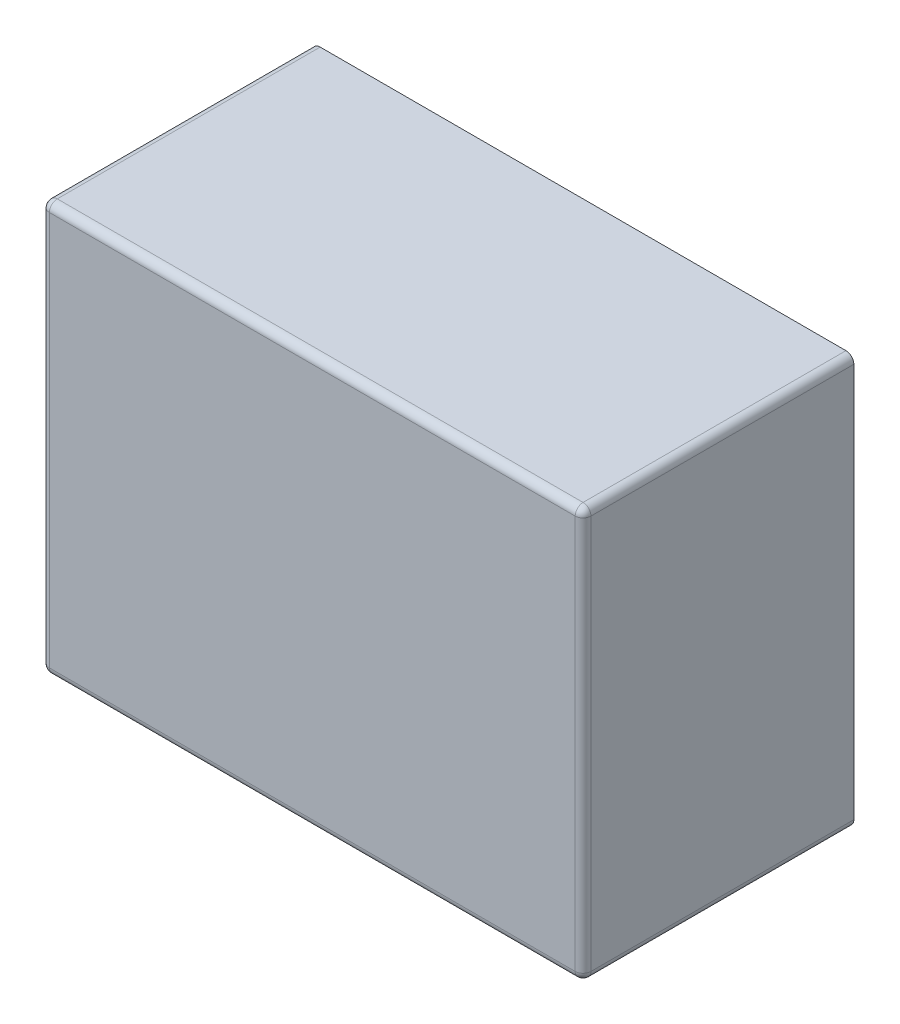
ISO-10303-21;
HEADER;
FILE_DESCRIPTION(('STEP AP214'),'2;1');
FILE_NAME('part.step','',(''),(''),'','','');
FILE_SCHEMA(('AUTOMOTIVE_DESIGN { 1 0 10303 214 1 1 1 1 }'));
ENDSEC;
DATA;
#1=APPLICATION_CONTEXT('core data for automotive mechanical design processes');
#2=APPLICATION_PROTOCOL_DEFINITION('international standard','automotive_design',2000,#1);
#3=PRODUCT_CONTEXT('',#1,'mechanical');
#4=PRODUCT('Part','Part','',(#3));
#5=PRODUCT_RELATED_PRODUCT_CATEGORY('part','',(#4));
#6=PRODUCT_DEFINITION_FORMATION('','',#4);
#7=PRODUCT_DEFINITION_CONTEXT('part definition',#1,'design');
#8=PRODUCT_DEFINITION('design','',#6,#7);
#9=PRODUCT_DEFINITION_SHAPE('','',#8);
#10=(LENGTH_UNIT() NAMED_UNIT(*) SI_UNIT(.MILLI.,.METRE.));
#11=(NAMED_UNIT(*) PLANE_ANGLE_UNIT() SI_UNIT($,.RADIAN.));
#12=(NAMED_UNIT(*) SI_UNIT($,.STERADIAN.) SOLID_ANGLE_UNIT());
#13=UNCERTAINTY_MEASURE_WITH_UNIT(LENGTH_MEASURE(1.E-05),#10,'distance_accuracy_value','');
#14=(GEOMETRIC_REPRESENTATION_CONTEXT(3) GLOBAL_UNCERTAINTY_ASSIGNED_CONTEXT((#13)) GLOBAL_UNIT_ASSIGNED_CONTEXT((#10,
#11,#12)) REPRESENTATION_CONTEXT('',''));
#15=CARTESIAN_POINT('',(0.,0.,0.));
#16=DIRECTION('',(0.,0.,1.));
#17=DIRECTION('',(1.,0.,0.));
#18=AXIS2_PLACEMENT_3D('',#15,#16,#17);
#19=CARTESIAN_POINT('',(0.,0.,103.));
#20=DIRECTION('',(0.,0.,1.));
#21=DIRECTION('',(1.,0.,0.));
#22=AXIS2_PLACEMENT_3D('',#19,#20,#21);
#23=PLANE('',#22);
#24=DIRECTION('',(1.,0.,0.));
#25=VECTOR('',#24,1.);
#26=CARTESIAN_POINT('',(-100.,-75.,103.));
#27=LINE('',#26,#25);
#28=CARTESIAN_POINT('',(-100.,-75.,103.));
#29=VERTEX_POINT('',#28);
#30=CARTESIAN_POINT('',(100.,-75.,103.));
#31=VERTEX_POINT('',#30);
#32=EDGE_CURVE('E245',#29,#31,#27,.T.);
#33=ORIENTED_EDGE('',*,*,#32,.T.);
#34=DIRECTION('',(0.,1.,0.));
#35=VECTOR('',#34,1.);
#36=CARTESIAN_POINT('',(100.,-75.,103.));
#37=LINE('',#36,#35);
#38=CARTESIAN_POINT('',(100.,75.,103.));
#39=VERTEX_POINT('',#38);
#40=EDGE_CURVE('E46',#31,#39,#37,.T.);
#41=ORIENTED_EDGE('',*,*,#40,.T.);
#42=DIRECTION('',(-1.,0.,0.));
#43=VECTOR('',#42,1.);
#44=CARTESIAN_POINT('',(100.,75.,103.));
#45=LINE('',#44,#43);
#46=CARTESIAN_POINT('',(-100.,75.,103.));
#47=VERTEX_POINT('',#46);
#48=EDGE_CURVE('E10',#39,#47,#45,.T.);
#49=ORIENTED_EDGE('',*,*,#48,.T.);
#50=DIRECTION('',(0.,-1.,0.));
#51=VECTOR('',#50,1.);
#52=CARTESIAN_POINT('',(-100.,75.,103.));
#53=LINE('',#52,#51);
#54=EDGE_CURVE('E297',#47,#29,#53,.T.);
#55=ORIENTED_EDGE('',*,*,#54,.T.);
#56=EDGE_LOOP('',(#33,#41,#49,#55));
#57=FACE_BOUND('',#56,.T.);
#58=ADVANCED_FACE('F16',(#57),#23,.T.);
#59=CARTESIAN_POINT('',(100.,75.,100.));
#60=DIRECTION('',(-1.,0.,0.));
#61=DIRECTION('',(0.,0.,-1.));
#62=AXIS2_PLACEMENT_3D('',#59,#60,#61);
#63=CYLINDRICAL_SURFACE('',#62,3.);
#64=CARTESIAN_POINT('',(-100.,75.,100.));
#65=DIRECTION('',(1.,0.,0.));
#66=DIRECTION('',(0.,0.,-1.));
#67=AXIS2_PLACEMENT_3D('',#64,#65,#66);
#68=CIRCLE('',#67,3.);
#69=CARTESIAN_POINT('',(-100.,78.,100.));
#70=VERTEX_POINT('',#69);
#71=EDGE_CURVE('E294',#70,#47,#68,.T.);
#72=ORIENTED_EDGE('',*,*,#71,.T.);
#73=ORIENTED_EDGE('',*,*,#48,.F.);
#74=CARTESIAN_POINT('',(100.,75.,100.));
#75=DIRECTION('',(1.,0.,0.));
#76=DIRECTION('',(0.,0.,-1.));
#77=AXIS2_PLACEMENT_3D('',#74,#75,#76);
#78=CIRCLE('',#77,3.);
#79=CARTESIAN_POINT('',(100.,78.,100.));
#80=VERTEX_POINT('',#79);
#81=EDGE_CURVE('E25',#80,#39,#78,.T.);
#82=ORIENTED_EDGE('',*,*,#81,.F.);
#83=DIRECTION('',(-1.,0.,0.));
#84=VECTOR('',#83,1.);
#85=CARTESIAN_POINT('',(100.,78.,100.));
#86=LINE('',#85,#84);
#87=EDGE_CURVE('E286',#80,#70,#86,.T.);
#88=ORIENTED_EDGE('',*,*,#87,.T.);
#89=EDGE_LOOP('',(#72,#73,#82,#88));
#90=FACE_BOUND('',#89,.T.);
#91=ADVANCED_FACE('F377',(#90),#63,.T.);
#92=CARTESIAN_POINT('',(100.,75.,100.));
#93=DIRECTION('',(0.,0.707106781186548,-0.707106781186548));
#94=DIRECTION('',(-0.577350269189626,-0.577350269189626,-0.577350269189626));
#95=AXIS2_PLACEMENT_3D('',#92,#93,#94);
#96=SPHERICAL_SURFACE('',#95,3.);
#97=CARTESIAN_POINT('',(100.,75.,100.));
#98=DIRECTION('',(0.,0.,1.));
#99=DIRECTION('',(0.,-1.,0.));
#100=AXIS2_PLACEMENT_3D('',#97,#98,#99);
#101=CIRCLE('',#100,3.);
#102=CARTESIAN_POINT('',(103.,75.,100.));
#103=VERTEX_POINT('',#102);
#104=EDGE_CURVE('E282',#103,#80,#101,.T.);
#105=ORIENTED_EDGE('',*,*,#104,.T.);
#106=ORIENTED_EDGE('',*,*,#81,.T.);
#107=CARTESIAN_POINT('',(100.,75.,100.));
#108=DIRECTION('',(0.,-1.,0.));
#109=DIRECTION('',(0.,0.,-1.));
#110=AXIS2_PLACEMENT_3D('',#107,#108,#109);
#111=CIRCLE('',#110,3.);
#112=EDGE_CURVE('E19',#103,#39,#111,.T.);
#113=ORIENTED_EDGE('',*,*,#112,.F.);
#114=EDGE_LOOP('',(#105,#106,#113));
#115=FACE_BOUND('',#114,.T.);
#116=ADVANCED_FACE('F376',(#115),#96,.T.);
#117=CARTESIAN_POINT('',(100.,-75.,100.));
#118=DIRECTION('',(0.,1.,0.));
#119=DIRECTION('',(0.,0.,-1.));
#120=AXIS2_PLACEMENT_3D('',#117,#118,#119);
#121=CYLINDRICAL_SURFACE('',#120,3.);
#122=ORIENTED_EDGE('',*,*,#112,.T.);
#123=ORIENTED_EDGE('',*,*,#40,.F.);
#124=CARTESIAN_POINT('',(100.,-75.,100.));
#125=DIRECTION('',(0.,-1.,0.));
#126=DIRECTION('',(0.,0.,-1.));
#127=AXIS2_PLACEMENT_3D('',#124,#125,#126);
#128=CIRCLE('',#127,3.);
#129=CARTESIAN_POINT('',(103.,-75.,100.));
#130=VERTEX_POINT('',#129);
#131=EDGE_CURVE('E249',#130,#31,#128,.T.);
#132=ORIENTED_EDGE('',*,*,#131,.F.);
#133=DIRECTION('',(0.,1.,0.));
#134=VECTOR('',#133,1.);
#135=CARTESIAN_POINT('',(103.,-75.,100.));
#136=LINE('',#135,#134);
#137=EDGE_CURVE('E259',#130,#103,#136,.T.);
#138=ORIENTED_EDGE('',*,*,#137,.T.);
#139=EDGE_LOOP('',(#122,#123,#132,#138));
#140=FACE_BOUND('',#139,.T.);
#141=ADVANCED_FACE('F409',(#140),#121,.T.);
#142=CARTESIAN_POINT('',(100.,-75.,100.));
#143=DIRECTION('',(0.707106781186548,0.,-0.707106781186548));
#144=DIRECTION('',(-0.577350269189626,0.577350269189626,-0.577350269189626));
#145=AXIS2_PLACEMENT_3D('',#142,#143,#144);
#146=SPHERICAL_SURFACE('',#145,3.);
#147=CARTESIAN_POINT('',(100.,-75.,100.));
#148=DIRECTION('',(0.,0.,1.));
#149=DIRECTION('',(-1.,0.,0.));
#150=AXIS2_PLACEMENT_3D('',#147,#148,#149);
#151=CIRCLE('',#150,3.);
#152=CARTESIAN_POINT('',(100.,-78.,100.));
#153=VERTEX_POINT('',#152);
#154=EDGE_CURVE('E264',#153,#130,#151,.T.);
#155=ORIENTED_EDGE('',*,*,#154,.T.);
#156=ORIENTED_EDGE('',*,*,#131,.T.);
#157=CARTESIAN_POINT('',(100.,-75.,100.));
#158=DIRECTION('',(-1.,0.,0.));
#159=DIRECTION('',(0.,0.,-1.));
#160=AXIS2_PLACEMENT_3D('',#157,#158,#159);
#161=CIRCLE('',#160,3.);
#162=EDGE_CURVE('E250',#153,#31,#161,.T.);
#163=ORIENTED_EDGE('',*,*,#162,.F.);
#164=EDGE_LOOP('',(#155,#156,#163));
#165=FACE_BOUND('',#164,.T.);
#166=ADVANCED_FACE('F351',(#165),#146,.T.);
#167=CARTESIAN_POINT('',(-100.,-75.,100.));
#168=DIRECTION('',(1.,0.,0.));
#169=DIRECTION('',(0.,0.,-1.));
#170=AXIS2_PLACEMENT_3D('',#167,#168,#169);
#171=CYLINDRICAL_SURFACE('',#170,3.);
#172=ORIENTED_EDGE('',*,*,#162,.T.);
#173=ORIENTED_EDGE('',*,*,#32,.F.);
#174=CARTESIAN_POINT('',(-100.,-75.,100.));
#175=DIRECTION('',(-1.,0.,0.));
#176=DIRECTION('',(0.,0.,-1.));
#177=AXIS2_PLACEMENT_3D('',#174,#175,#176);
#178=CIRCLE('',#177,3.);
#179=CARTESIAN_POINT('',(-100.,-78.,100.));
#180=VERTEX_POINT('',#179);
#181=EDGE_CURVE('E301',#180,#29,#178,.T.);
#182=ORIENTED_EDGE('',*,*,#181,.F.);
#183=DIRECTION('',(1.,0.,0.));
#184=VECTOR('',#183,1.);
#185=CARTESIAN_POINT('',(-100.,-78.,100.));
#186=LINE('',#185,#184);
#187=EDGE_CURVE('E258',#180,#153,#186,.T.);
#188=ORIENTED_EDGE('',*,*,#187,.T.);
#189=EDGE_LOOP('',(#172,#173,#182,#188));
#190=FACE_BOUND('',#189,.T.);
#191=ADVANCED_FACE('F354',(#190),#171,.T.);
#192=CARTESIAN_POINT('',(-100.,-75.,100.));
#193=DIRECTION('',(0.707106781186548,0.,0.707106781186548));
#194=DIRECTION('',(0.577350269189626,0.577350269189626,-0.577350269189626));
#195=AXIS2_PLACEMENT_3D('',#192,#193,#194);
#196=SPHERICAL_SURFACE('',#195,3.);
#197=CARTESIAN_POINT('',(-100.,-75.,100.));
#198=DIRECTION('',(0.,0.,-1.));
#199=DIRECTION('',(1.,0.,0.));
#200=AXIS2_PLACEMENT_3D('',#197,#198,#199);
#201=CIRCLE('',#200,3.);
#202=CARTESIAN_POINT('',(-103.,-75.,100.));
#203=VERTEX_POINT('',#202);
#204=EDGE_CURVE('E244',#180,#203,#201,.T.);
#205=ORIENTED_EDGE('',*,*,#204,.F.);
#206=ORIENTED_EDGE('',*,*,#181,.T.);
#207=CARTESIAN_POINT('',(-100.,-75.,100.));
#208=DIRECTION('',(0.,1.,0.));
#209=DIRECTION('',(0.,0.,-1.));
#210=AXIS2_PLACEMENT_3D('',#207,#208,#209);
#211=CIRCLE('',#210,3.);
#212=EDGE_CURVE('E187',#203,#29,#211,.T.);
#213=ORIENTED_EDGE('',*,*,#212,.F.);
#214=EDGE_LOOP('',(#205,#206,#213));
#215=FACE_BOUND('',#214,.T.);
#216=ADVANCED_FACE('F385',(#215),#196,.T.);
#217=CARTESIAN_POINT('',(-100.,75.,100.));
#218=DIRECTION('',(0.,-1.,0.));
#219=DIRECTION('',(0.,0.,-1.));
#220=AXIS2_PLACEMENT_3D('',#217,#218,#219);
#221=CYLINDRICAL_SURFACE('',#220,3.);
#222=ORIENTED_EDGE('',*,*,#212,.T.);
#223=ORIENTED_EDGE('',*,*,#54,.F.);
#224=CARTESIAN_POINT('',(-100.,75.,100.));
#225=DIRECTION('',(0.,1.,0.));
#226=DIRECTION('',(0.,0.,-1.));
#227=AXIS2_PLACEMENT_3D('',#224,#225,#226);
#228=CIRCLE('',#227,3.);
#229=CARTESIAN_POINT('',(-103.,75.,100.));
#230=VERTEX_POINT('',#229);
#231=EDGE_CURVE('E290',#230,#47,#228,.T.);
#232=ORIENTED_EDGE('',*,*,#231,.F.);
#233=DIRECTION('',(0.,-1.,0.));
#234=VECTOR('',#233,1.);
#235=CARTESIAN_POINT('',(-103.,75.,100.));
#236=LINE('',#235,#234);
#237=EDGE_CURVE('E195',#230,#203,#236,.T.);
#238=ORIENTED_EDGE('',*,*,#237,.T.);
#239=EDGE_LOOP('',(#222,#223,#232,#238));
#240=FACE_BOUND('',#239,.T.);
#241=ADVANCED_FACE('F383',(#240),#221,.T.);
#242=CARTESIAN_POINT('',(-100.,75.,100.));
#243=DIRECTION('',(-0.707106781186548,0.,-0.707106781186548));
#244=DIRECTION('',(0.577350269189626,-0.577350269189626,-0.577350269189626));
#245=AXIS2_PLACEMENT_3D('',#242,#243,#244);
#246=SPHERICAL_SURFACE('',#245,3.);
#247=CARTESIAN_POINT('',(-100.,75.,100.));
#248=DIRECTION('',(0.,0.,1.));
#249=DIRECTION('',(1.,0.,0.));
#250=AXIS2_PLACEMENT_3D('',#247,#248,#249);
#251=CIRCLE('',#250,3.);
#252=EDGE_CURVE('E228',#70,#230,#251,.T.);
#253=ORIENTED_EDGE('',*,*,#252,.T.);
#254=ORIENTED_EDGE('',*,*,#231,.T.);
#255=ORIENTED_EDGE('',*,*,#71,.F.);
#256=EDGE_LOOP('',(#253,#254,#255));
#257=FACE_BOUND('',#256,.T.);
#258=ADVANCED_FACE('F379',(#257),#246,.T.);
#259=CARTESIAN_POINT('',(100.,78.,0.));
#260=DIRECTION('',(0.,-1.,0.));
#261=DIRECTION('',(0.,0.,-1.));
#262=AXIS2_PLACEMENT_3D('',#259,#260,#261);
#263=PLANE('',#262);
#264=ORIENTED_EDGE('',*,*,#87,.F.);
#265=DIRECTION('',(0.,0.,1.));
#266=VECTOR('',#265,1.);
#267=CARTESIAN_POINT('',(100.,78.,0.));
#268=LINE('',#267,#266);
#269=CARTESIAN_POINT('',(100.,78.,0.));
#270=VERTEX_POINT('',#269);
#271=EDGE_CURVE('E278',#270,#80,#268,.T.);
#272=ORIENTED_EDGE('',*,*,#271,.F.);
#273=DIRECTION('',(-1.,0.,0.));
#274=VECTOR('',#273,1.);
#275=CARTESIAN_POINT('',(100.,78.,0.));
#276=LINE('',#275,#274);
#277=CARTESIAN_POINT('',(-100.,78.,0.));
#278=VERTEX_POINT('',#277);
#279=EDGE_CURVE('E163',#270,#278,#276,.T.);
#280=ORIENTED_EDGE('',*,*,#279,.T.);
#281=DIRECTION('',(0.,0.,1.));
#282=VECTOR('',#281,1.);
#283=CARTESIAN_POINT('',(-100.,78.,0.));
#284=LINE('',#283,#282);
#285=EDGE_CURVE('E232',#278,#70,#284,.T.);
#286=ORIENTED_EDGE('',*,*,#285,.T.);
#287=EDGE_LOOP('',(#264,#272,#280,#286));
#288=FACE_BOUND('',#287,.T.);
#289=ADVANCED_FACE('F371',(#288),#263,.F.);
#290=CARTESIAN_POINT('',(100.,75.,0.));
#291=DIRECTION('',(0.,0.,1.));
#292=DIRECTION('',(0.,-1.,0.));
#293=AXIS2_PLACEMENT_3D('',#290,#291,#292);
#294=CYLINDRICAL_SURFACE('',#293,3.);
#295=ORIENTED_EDGE('',*,*,#271,.T.);
#296=ORIENTED_EDGE('',*,*,#104,.F.);
#297=DIRECTION('',(0.,0.,1.));
#298=VECTOR('',#297,1.);
#299=CARTESIAN_POINT('',(103.,75.,0.));
#300=LINE('',#299,#298);
#301=CARTESIAN_POINT('',(103.,75.,0.));
#302=VERTEX_POINT('',#301);
#303=EDGE_CURVE('E263',#302,#103,#300,.T.);
#304=ORIENTED_EDGE('',*,*,#303,.F.);
#305=CARTESIAN_POINT('',(100.,75.,0.));
#306=DIRECTION('',(0.,0.,1.));
#307=DIRECTION('',(0.,-1.,0.));
#308=AXIS2_PLACEMENT_3D('',#305,#306,#307);
#309=CIRCLE('',#308,3.);
#310=EDGE_CURVE('E190',#302,#270,#309,.T.);
#311=ORIENTED_EDGE('',*,*,#310,.T.);
#312=EDGE_LOOP('',(#295,#296,#304,#311));
#313=FACE_BOUND('',#312,.T.);
#314=ADVANCED_FACE('F374',(#313),#294,.T.);
#315=CARTESIAN_POINT('',(103.,-75.,0.));
#316=DIRECTION('',(-1.,0.,0.));
#317=DIRECTION('',(0.,0.,1.));
#318=AXIS2_PLACEMENT_3D('',#315,#316,#317);
#319=PLANE('',#318);
#320=ORIENTED_EDGE('',*,*,#137,.F.);
#321=DIRECTION('',(0.,0.,1.));
#322=VECTOR('',#321,1.);
#323=CARTESIAN_POINT('',(103.,-75.,0.));
#324=LINE('',#323,#322);
#325=CARTESIAN_POINT('',(103.,-75.,0.));
#326=VERTEX_POINT('',#325);
#327=EDGE_CURVE('E268',#326,#130,#324,.T.);
#328=ORIENTED_EDGE('',*,*,#327,.F.);
#329=DIRECTION('',(0.,1.,0.));
#330=VECTOR('',#329,1.);
#331=CARTESIAN_POINT('',(103.,-75.,0.));
#332=LINE('',#331,#330);
#333=EDGE_CURVE('E194',#326,#302,#332,.T.);
#334=ORIENTED_EDGE('',*,*,#333,.T.);
#335=ORIENTED_EDGE('',*,*,#303,.T.);
#336=EDGE_LOOP('',(#320,#328,#334,#335));
#337=FACE_BOUND('',#336,.T.);
#338=ADVANCED_FACE('F350',(#337),#319,.F.);
#339=CARTESIAN_POINT('',(100.,-75.,0.));
#340=DIRECTION('',(0.,0.,1.));
#341=DIRECTION('',(-1.,0.,0.));
#342=AXIS2_PLACEMENT_3D('',#339,#340,#341);
#343=CYLINDRICAL_SURFACE('',#342,3.);
#344=ORIENTED_EDGE('',*,*,#327,.T.);
#345=ORIENTED_EDGE('',*,*,#154,.F.);
#346=DIRECTION('',(0.,0.,1.));
#347=VECTOR('',#346,1.);
#348=CARTESIAN_POINT('',(100.,-78.,0.));
#349=LINE('',#348,#347);
#350=CARTESIAN_POINT('',(100.,-78.,0.));
#351=VERTEX_POINT('',#350);
#352=EDGE_CURVE('E254',#351,#153,#349,.T.);
#353=ORIENTED_EDGE('',*,*,#352,.F.);
#354=CARTESIAN_POINT('',(100.,-75.,0.));
#355=DIRECTION('',(0.,0.,1.));
#356=DIRECTION('',(-1.,0.,0.));
#357=AXIS2_PLACEMENT_3D('',#354,#355,#356);
#358=CIRCLE('',#357,3.);
#359=EDGE_CURVE('E206',#351,#326,#358,.T.);
#360=ORIENTED_EDGE('',*,*,#359,.T.);
#361=EDGE_LOOP('',(#344,#345,#353,#360));
#362=FACE_BOUND('',#361,.T.);
#363=ADVANCED_FACE('F342',(#362),#343,.T.);
#364=CARTESIAN_POINT('',(-100.,-78.,0.));
#365=DIRECTION('',(0.,1.,0.));
#366=DIRECTION('',(1.,0.,0.));
#367=AXIS2_PLACEMENT_3D('',#364,#365,#366);
#368=PLANE('',#367);
#369=DIRECTION('',(1.,0.,0.));
#370=VECTOR('',#369,1.);
#371=CARTESIAN_POINT('',(-100.,-78.,0.));
#372=LINE('',#371,#370);
#373=CARTESIAN_POINT('',(-100.,-78.,0.));
#374=VERTEX_POINT('',#373);
#375=EDGE_CURVE('E201',#374,#351,#372,.T.);
#376=ORIENTED_EDGE('',*,*,#375,.T.);
#377=ORIENTED_EDGE('',*,*,#352,.T.);
#378=ORIENTED_EDGE('',*,*,#187,.F.);
#379=DIRECTION('',(0.,0.,1.));
#380=VECTOR('',#379,1.);
#381=CARTESIAN_POINT('',(-100.,-78.,0.));
#382=LINE('',#381,#380);
#383=EDGE_CURVE('E199',#374,#180,#382,.T.);
#384=ORIENTED_EDGE('',*,*,#383,.F.);
#385=EDGE_LOOP('',(#376,#377,#378,#384));
#386=FACE_BOUND('',#385,.T.);
#387=ADVANCED_FACE('F357',(#386),#368,.F.);
#388=CARTESIAN_POINT('',(-100.,-75.,0.));
#389=DIRECTION('',(0.,0.,1.));
#390=DIRECTION('',(1.,0.,0.));
#391=AXIS2_PLACEMENT_3D('',#388,#389,#390);
#392=CYLINDRICAL_SURFACE('',#391,3.);
#393=CARTESIAN_POINT('',(-100.,-75.,0.));
#394=DIRECTION('',(0.,0.,-1.));
#395=DIRECTION('',(1.,0.,0.));
#396=AXIS2_PLACEMENT_3D('',#393,#394,#395);
#397=CIRCLE('',#396,3.);
#398=CARTESIAN_POINT('',(-103.,-75.,0.));
#399=VERTEX_POINT('',#398);
#400=EDGE_CURVE('E205',#374,#399,#397,.T.);
#401=ORIENTED_EDGE('',*,*,#400,.F.);
#402=ORIENTED_EDGE('',*,*,#383,.T.);
#403=ORIENTED_EDGE('',*,*,#204,.T.);
#404=DIRECTION('',(0.,0.,1.));
#405=VECTOR('',#404,1.);
#406=CARTESIAN_POINT('',(-103.,-75.,0.));
#407=LINE('',#406,#405);
#408=EDGE_CURVE('E200',#399,#203,#407,.T.);
#409=ORIENTED_EDGE('',*,*,#408,.F.);
#410=EDGE_LOOP('',(#401,#402,#403,#409));
#411=FACE_BOUND('',#410,.T.);
#412=ADVANCED_FACE('F362',(#411),#392,.T.);
#413=CARTESIAN_POINT('',(-103.,75.,0.));
#414=DIRECTION('',(1.,0.,0.));
#415=DIRECTION('',(0.,1.,0.));
#416=AXIS2_PLACEMENT_3D('',#413,#414,#415);
#417=PLANE('',#416);
#418=ORIENTED_EDGE('',*,*,#408,.T.);
#419=ORIENTED_EDGE('',*,*,#237,.F.);
#420=DIRECTION('',(0.,0.,1.));
#421=VECTOR('',#420,1.);
#422=CARTESIAN_POINT('',(-103.,75.,0.));
#423=LINE('',#422,#421);
#424=CARTESIAN_POINT('',(-103.,75.,0.));
#425=VERTEX_POINT('',#424);
#426=EDGE_CURVE('E224',#425,#230,#423,.T.);
#427=ORIENTED_EDGE('',*,*,#426,.F.);
#428=DIRECTION('',(0.,-1.,0.));
#429=VECTOR('',#428,1.);
#430=CARTESIAN_POINT('',(-103.,75.,0.));
#431=LINE('',#430,#429);
#432=EDGE_CURVE('E212',#425,#399,#431,.T.);
#433=ORIENTED_EDGE('',*,*,#432,.T.);
#434=EDGE_LOOP('',(#418,#419,#427,#433));
#435=FACE_BOUND('',#434,.T.);
#436=ADVANCED_FACE('F365',(#435),#417,.F.);
#437=CARTESIAN_POINT('',(-100.,75.,0.));
#438=DIRECTION('',(0.,0.,1.));
#439=DIRECTION('',(1.,0.,0.));
#440=AXIS2_PLACEMENT_3D('',#437,#438,#439);
#441=CYLINDRICAL_SURFACE('',#440,3.);
#442=ORIENTED_EDGE('',*,*,#426,.T.);
#443=ORIENTED_EDGE('',*,*,#252,.F.);
#444=ORIENTED_EDGE('',*,*,#285,.F.);
#445=CARTESIAN_POINT('',(-100.,75.,0.));
#446=DIRECTION('',(0.,0.,1.));
#447=DIRECTION('',(1.,0.,0.));
#448=AXIS2_PLACEMENT_3D('',#445,#446,#447);
#449=CIRCLE('',#448,3.);
#450=EDGE_CURVE('E217',#278,#425,#449,.T.);
#451=ORIENTED_EDGE('',*,*,#450,.T.);
#452=EDGE_LOOP('',(#442,#443,#444,#451));
#453=FACE_BOUND('',#452,.T.);
#454=ADVANCED_FACE('F368',(#453),#441,.T.);
#455=CARTESIAN_POINT('',(100.,75.,0.));
#456=DIRECTION('',(0.,-1.,0.));
#457=DIRECTION('',(0.,0.,-1.));
#458=AXIS2_PLACEMENT_3D('',#455,#456,#457);
#459=PLANE('',#458);
#460=DIRECTION('',(0.,0.,1.));
#461=VECTOR('',#460,1.);
#462=CARTESIAN_POINT('',(100.,75.,0.));
#463=LINE('',#462,#461);
#464=CARTESIAN_POINT('',(100.,75.,0.));
#465=VERTEX_POINT('',#464);
#466=CARTESIAN_POINT('',(100.,75.,100.));
#467=VERTEX_POINT('',#466);
#468=EDGE_CURVE('E156',#465,#467,#463,.T.);
#469=ORIENTED_EDGE('',*,*,#468,.T.);
#470=DIRECTION('',(-1.,0.,0.));
#471=VECTOR('',#470,1.);
#472=CARTESIAN_POINT('',(100.,75.,100.));
#473=LINE('',#472,#471);
#474=CARTESIAN_POINT('',(-100.,75.,100.));
#475=VERTEX_POINT('',#474);
#476=EDGE_CURVE('E221',#467,#475,#473,.T.);
#477=ORIENTED_EDGE('',*,*,#476,.T.);
#478=DIRECTION('',(0.,0.,1.));
#479=VECTOR('',#478,1.);
#480=CARTESIAN_POINT('',(-100.,75.,0.));
#481=LINE('',#480,#479);
#482=CARTESIAN_POINT('',(-100.,75.,0.));
#483=VERTEX_POINT('',#482);
#484=EDGE_CURVE('E159',#483,#475,#481,.T.);
#485=ORIENTED_EDGE('',*,*,#484,.F.);
#486=DIRECTION('',(-1.,0.,0.));
#487=VECTOR('',#486,1.);
#488=CARTESIAN_POINT('',(100.,75.,0.));
#489=LINE('',#488,#487);
#490=EDGE_CURVE('E152',#465,#483,#489,.T.);
#491=ORIENTED_EDGE('',*,*,#490,.F.);
#492=EDGE_LOOP('',(#469,#477,#485,#491));
#493=FACE_BOUND('',#492,.T.);
#494=ADVANCED_FACE('F154',(#493),#459,.T.);
#495=CARTESIAN_POINT('',(0.,0.,100.));
#496=DIRECTION('',(0.,0.,1.));
#497=DIRECTION('',(1.,0.,0.));
#498=AXIS2_PLACEMENT_3D('',#495,#496,#497);
#499=PLANE('',#498);
#500=DIRECTION('',(0.,-1.,0.));
#501=VECTOR('',#500,1.);
#502=CARTESIAN_POINT('',(-100.,75.,100.));
#503=LINE('',#502,#501);
#504=CARTESIAN_POINT('',(-100.,-75.,100.));
#505=VERTEX_POINT('',#504);
#506=EDGE_CURVE('E323',#475,#505,#503,.T.);
#507=ORIENTED_EDGE('',*,*,#506,.F.);
#508=ORIENTED_EDGE('',*,*,#476,.F.);
#509=DIRECTION('',(0.,1.,0.));
#510=VECTOR('',#509,1.);
#511=CARTESIAN_POINT('',(100.,-75.,100.));
#512=LINE('',#511,#510);
#513=CARTESIAN_POINT('',(100.,-75.,100.));
#514=VERTEX_POINT('',#513);
#515=EDGE_CURVE('E176',#514,#467,#512,.T.);
#516=ORIENTED_EDGE('',*,*,#515,.F.);
#517=DIRECTION('',(1.,0.,0.));
#518=VECTOR('',#517,1.);
#519=CARTESIAN_POINT('',(-100.,-75.,100.));
#520=LINE('',#519,#518);
#521=EDGE_CURVE('E325',#505,#514,#520,.T.);
#522=ORIENTED_EDGE('',*,*,#521,.F.);
#523=EDGE_LOOP('',(#507,#508,#516,#522));
#524=FACE_BOUND('',#523,.T.);
#525=ADVANCED_FACE('F522',(#524),#499,.F.);
#526=CARTESIAN_POINT('',(0.,0.,0.));
#527=DIRECTION('',(0.,0.,1.));
#528=DIRECTION('',(1.,0.,0.));
#529=AXIS2_PLACEMENT_3D('',#526,#527,#528);
#530=PLANE('',#529);
#531=ORIENTED_EDGE('',*,*,#279,.F.);
#532=ORIENTED_EDGE('',*,*,#310,.F.);
#533=ORIENTED_EDGE('',*,*,#333,.F.);
#534=ORIENTED_EDGE('',*,*,#359,.F.);
#535=ORIENTED_EDGE('',*,*,#375,.F.);
#536=ORIENTED_EDGE('',*,*,#400,.T.);
#537=ORIENTED_EDGE('',*,*,#432,.F.);
#538=ORIENTED_EDGE('',*,*,#450,.F.);
#539=EDGE_LOOP('',(#531,#532,#533,#534,#535,#536,#537,#538));
#540=FACE_BOUND('',#539,.T.);
#541=DIRECTION('',(0.,1.,0.));
#542=VECTOR('',#541,1.);
#543=CARTESIAN_POINT('',(100.,-75.,0.));
#544=LINE('',#543,#542);
#545=CARTESIAN_POINT('',(100.,-75.,0.));
#546=VERTEX_POINT('',#545);
#547=EDGE_CURVE('E164',#546,#465,#544,.T.);
#548=ORIENTED_EDGE('',*,*,#547,.T.);
#549=ORIENTED_EDGE('',*,*,#490,.T.);
#550=DIRECTION('',(0.,-1.,0.));
#551=VECTOR('',#550,1.);
#552=CARTESIAN_POINT('',(-100.,75.,0.));
#553=LINE('',#552,#551);
#554=CARTESIAN_POINT('',(-100.,-75.,0.));
#555=VERTEX_POINT('',#554);
#556=EDGE_CURVE('E183',#483,#555,#553,.T.);
#557=ORIENTED_EDGE('',*,*,#556,.T.);
#558=DIRECTION('',(1.,0.,0.));
#559=VECTOR('',#558,1.);
#560=CARTESIAN_POINT('',(-100.,-75.,0.));
#561=LINE('',#560,#559);
#562=EDGE_CURVE('E169',#555,#546,#561,.T.);
#563=ORIENTED_EDGE('',*,*,#562,.T.);
#564=EDGE_LOOP('',(#548,#549,#557,#563));
#565=FACE_BOUND('',#564,.T.);
#566=ADVANCED_FACE('F167',(#540,#565),#530,.F.);
#567=CARTESIAN_POINT('',(100.,-75.,0.));
#568=DIRECTION('',(-1.,0.,0.));
#569=DIRECTION('',(0.,0.,1.));
#570=AXIS2_PLACEMENT_3D('',#567,#568,#569);
#571=PLANE('',#570);
#572=DIRECTION('',(0.,0.,1.));
#573=VECTOR('',#572,1.);
#574=CARTESIAN_POINT('',(100.,-75.,0.));
#575=LINE('',#574,#573);
#576=EDGE_CURVE('E329',#546,#514,#575,.T.);
#577=ORIENTED_EDGE('',*,*,#576,.T.);
#578=ORIENTED_EDGE('',*,*,#515,.T.);
#579=ORIENTED_EDGE('',*,*,#468,.F.);
#580=ORIENTED_EDGE('',*,*,#547,.F.);
#581=EDGE_LOOP('',(#577,#578,#579,#580));
#582=FACE_BOUND('',#581,.T.);
#583=ADVANCED_FACE('F175',(#582),#571,.T.);
#584=CARTESIAN_POINT('',(-100.,75.,0.));
#585=DIRECTION('',(1.,0.,0.));
#586=DIRECTION('',(0.,1.,0.));
#587=AXIS2_PLACEMENT_3D('',#584,#585,#586);
#588=PLANE('',#587);
#589=ORIENTED_EDGE('',*,*,#484,.T.);
#590=ORIENTED_EDGE('',*,*,#506,.T.);
#591=DIRECTION('',(0.,0.,1.));
#592=VECTOR('',#591,1.);
#593=CARTESIAN_POINT('',(-100.,-75.,0.));
#594=LINE('',#593,#592);
#595=EDGE_CURVE('E321',#555,#505,#594,.T.);
#596=ORIENTED_EDGE('',*,*,#595,.F.);
#597=ORIENTED_EDGE('',*,*,#556,.F.);
#598=EDGE_LOOP('',(#589,#590,#596,#597));
#599=FACE_BOUND('',#598,.T.);
#600=ADVANCED_FACE('F546',(#599),#588,.T.);
#601=CARTESIAN_POINT('',(-100.,-75.,0.));
#602=DIRECTION('',(0.,1.,0.));
#603=DIRECTION('',(1.,0.,0.));
#604=AXIS2_PLACEMENT_3D('',#601,#602,#603);
#605=PLANE('',#604);
#606=ORIENTED_EDGE('',*,*,#595,.T.);
#607=ORIENTED_EDGE('',*,*,#521,.T.);
#608=ORIENTED_EDGE('',*,*,#576,.F.);
#609=ORIENTED_EDGE('',*,*,#562,.F.);
#610=EDGE_LOOP('',(#606,#607,#608,#609));
#611=FACE_BOUND('',#610,.T.);
#612=ADVANCED_FACE('F554',(#611),#605,.T.);
#613=CLOSED_SHELL('',(#58,#91,#116,#141,#166,#191,#216,#241,#258,#289,#314,#338,#363,#387,#412,
#436,#454,#494,#525,#566,#583,#600,#612));
#614=MANIFOLD_SOLID_BREP('B1',#613);
#615=ADVANCED_BREP_SHAPE_REPRESENTATION('',(#18,#614),#14);
#616=SHAPE_DEFINITION_REPRESENTATION(#9,#615);
ENDSEC;
END-ISO-10303-21;
